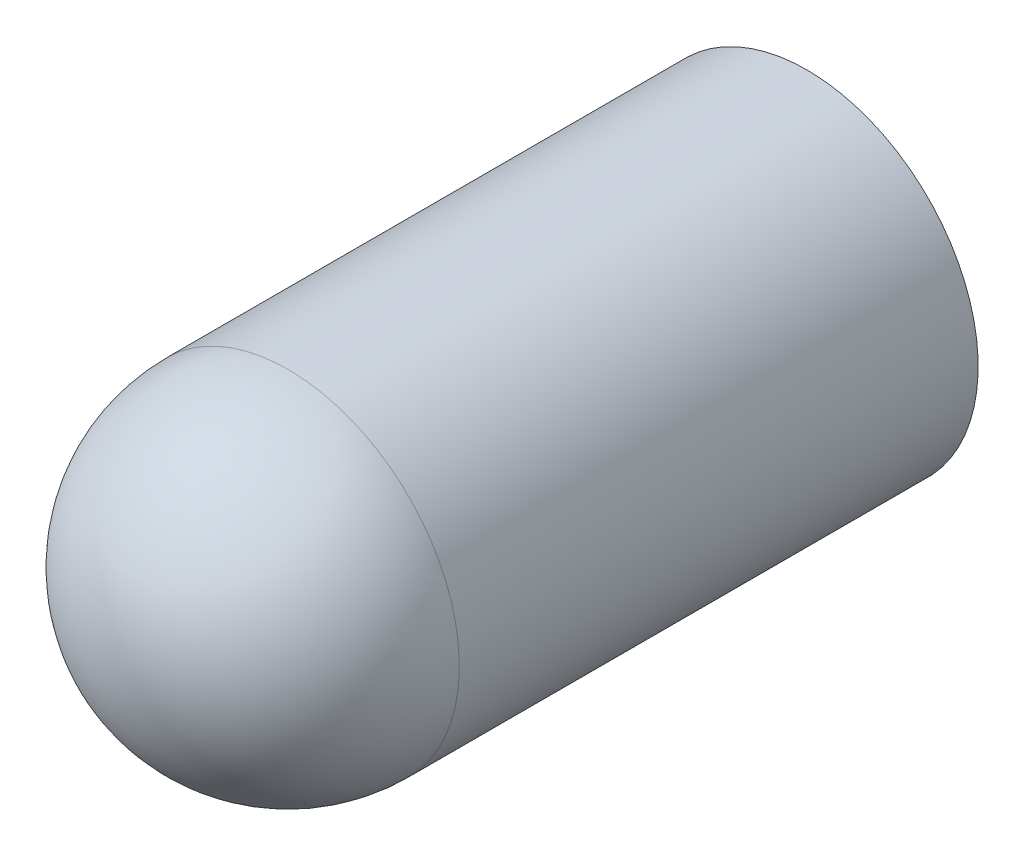
ISO-10303-21;
HEADER;
FILE_DESCRIPTION(('STEP AP214'),'2;1');
FILE_NAME('part.step','',(''),(''),'','','');
FILE_SCHEMA(('AUTOMOTIVE_DESIGN { 1 0 10303 214 1 1 1 1 }'));
ENDSEC;
DATA;
#1=APPLICATION_CONTEXT('core data for automotive mechanical design processes');
#2=APPLICATION_PROTOCOL_DEFINITION('international standard','automotive_design',2000,#1);
#3=PRODUCT_CONTEXT('',#1,'mechanical');
#4=PRODUCT('Part','Part','',(#3));
#5=PRODUCT_RELATED_PRODUCT_CATEGORY('part','',(#4));
#6=PRODUCT_DEFINITION_FORMATION('','',#4);
#7=PRODUCT_DEFINITION_CONTEXT('part definition',#1,'design');
#8=PRODUCT_DEFINITION('design','',#6,#7);
#9=PRODUCT_DEFINITION_SHAPE('','',#8);
#10=(LENGTH_UNIT() NAMED_UNIT(*) SI_UNIT(.MILLI.,.METRE.));
#11=(NAMED_UNIT(*) PLANE_ANGLE_UNIT() SI_UNIT($,.RADIAN.));
#12=(NAMED_UNIT(*) SI_UNIT($,.STERADIAN.) SOLID_ANGLE_UNIT());
#13=UNCERTAINTY_MEASURE_WITH_UNIT(LENGTH_MEASURE(1.E-05),#10,'distance_accuracy_value','');
#14=(GEOMETRIC_REPRESENTATION_CONTEXT(3) GLOBAL_UNCERTAINTY_ASSIGNED_CONTEXT((#13)) GLOBAL_UNIT_ASSIGNED_CONTEXT((#10,
#11,#12)) REPRESENTATION_CONTEXT('',''));
#15=CARTESIAN_POINT('',(0.,0.,0.));
#16=DIRECTION('',(0.,0.,1.));
#17=DIRECTION('',(1.,0.,0.));
#18=AXIS2_PLACEMENT_3D('',#15,#16,#17);
#19=CARTESIAN_POINT('',(1.651,0.,0.));
#20=DIRECTION('',(0.,0.,1.));
#21=DIRECTION('',(1.,0.,0.));
#22=AXIS2_PLACEMENT_3D('',#19,#20,#21);
#23=PLANE('',#22);
#24=CARTESIAN_POINT('',(0.,0.,0.));
#25=DIRECTION('',(0.,0.,-1.));
#26=DIRECTION('',(-1.,0.,0.));
#27=AXIS2_PLACEMENT_3D('',#24,#25,#26);
#28=CIRCLE('',#27,1.651);
#29=CARTESIAN_POINT('',(-1.651,0.,0.));
#30=VERTEX_POINT('',#29);
#31=EDGE_CURVE('E54',#30,#30,#28,.T.);
#32=ORIENTED_EDGE('',*,*,#31,.F.);
#33=EDGE_LOOP('',(#32));
#34=FACE_BOUND('',#33,.T.);
#35=CARTESIAN_POINT('',(0.,0.,0.));
#36=DIRECTION('',(0.,0.,-1.));
#37=DIRECTION('',(-1.,0.,0.));
#38=AXIS2_PLACEMENT_3D('',#35,#36,#37);
#39=CIRCLE('',#38,4.191);
#40=CARTESIAN_POINT('',(-4.191,0.,0.));
#41=VERTEX_POINT('',#40);
#42=EDGE_CURVE('E10',#41,#41,#39,.T.);
#43=ORIENTED_EDGE('',*,*,#42,.T.);
#44=EDGE_LOOP('',(#43));
#45=FACE_BOUND('',#44,.T.);
#46=ADVANCED_FACE('F37',(#34,#45),#23,.F.);
#47=CARTESIAN_POINT('',(0.,0.,0.));
#48=DIRECTION('',(0.,0.,-1.));
#49=DIRECTION('',(-1.,0.,0.));
#50=AXIS2_PLACEMENT_3D('',#47,#48,#49);
#51=CYLINDRICAL_SURFACE('',#50,4.191);
#52=ORIENTED_EDGE('',*,*,#42,.F.);
#53=EDGE_LOOP('',(#52));
#54=FACE_BOUND('',#53,.T.);
#55=CARTESIAN_POINT('',(0.,0.,12.7));
#56=DIRECTION('',(0.,0.,-1.));
#57=DIRECTION('',(-1.,0.,0.));
#58=AXIS2_PLACEMENT_3D('',#55,#56,#57);
#59=CIRCLE('',#58,4.191);
#60=CARTESIAN_POINT('',(-4.191,0.,12.7));
#61=VERTEX_POINT('',#60);
#62=EDGE_CURVE('E44',#61,#61,#59,.T.);
#63=ORIENTED_EDGE('',*,*,#62,.T.);
#64=EDGE_LOOP('',(#63));
#65=FACE_BOUND('',#64,.T.);
#66=ADVANCED_FACE('F64',(#54,#65),#51,.T.);
#67=CARTESIAN_POINT('',(0.,0.,12.7));
#68=DIRECTION('',(0.,0.,-1.));
#69=DIRECTION('',(-1.,0.,0.));
#70=AXIS2_PLACEMENT_3D('',#67,#68,#69);
#71=SPHERICAL_SURFACE('',#70,4.191);
#72=ORIENTED_EDGE('',*,*,#62,.F.);
#73=EDGE_LOOP('',(#72));
#74=FACE_BOUND('',#73,.T.);
#75=ADVANCED_FACE('F68',(#74),#71,.T.);
#76=CARTESIAN_POINT('',(0.,0.,12.7));
#77=DIRECTION('',(0.,0.,-1.));
#78=DIRECTION('',(1.,0.,0.));
#79=AXIS2_PLACEMENT_3D('',#76,#77,#78);
#80=SPHERICAL_SURFACE('',#79,1.651);
#81=CARTESIAN_POINT('',(0.,0.,12.7));
#82=DIRECTION('',(0.,0.,-1.));
#83=DIRECTION('',(-1.,0.,0.));
#84=AXIS2_PLACEMENT_3D('',#81,#82,#83);
#85=CIRCLE('',#84,1.651);
#86=CARTESIAN_POINT('',(-1.651,0.,12.7));
#87=VERTEX_POINT('',#86);
#88=EDGE_CURVE('E49',#87,#87,#85,.T.);
#89=ORIENTED_EDGE('',*,*,#88,.T.);
#90=EDGE_LOOP('',(#89));
#91=FACE_BOUND('',#90,.T.);
#92=ADVANCED_FACE('F73',(#91),#80,.F.);
#93=CARTESIAN_POINT('',(0.,0.,0.));
#94=DIRECTION('',(0.,0.,-1.));
#95=DIRECTION('',(-1.,0.,0.));
#96=AXIS2_PLACEMENT_3D('',#93,#94,#95);
#97=CYLINDRICAL_SURFACE('',#96,1.651);
#98=ORIENTED_EDGE('',*,*,#88,.F.);
#99=EDGE_LOOP('',(#98));
#100=FACE_BOUND('',#99,.T.);
#101=ORIENTED_EDGE('',*,*,#31,.T.);
#102=EDGE_LOOP('',(#101));
#103=FACE_BOUND('',#102,.T.);
#104=ADVANCED_FACE('F61',(#100,#103),#97,.F.);
#105=CLOSED_SHELL('',(#46,#66,#75,#92,#104));
#106=MANIFOLD_SOLID_BREP('B2',#105);
#107=ADVANCED_BREP_SHAPE_REPRESENTATION('',(#18,#106),#14);
#108=SHAPE_DEFINITION_REPRESENTATION(#9,#107);
ENDSEC;
END-ISO-10303-21;
